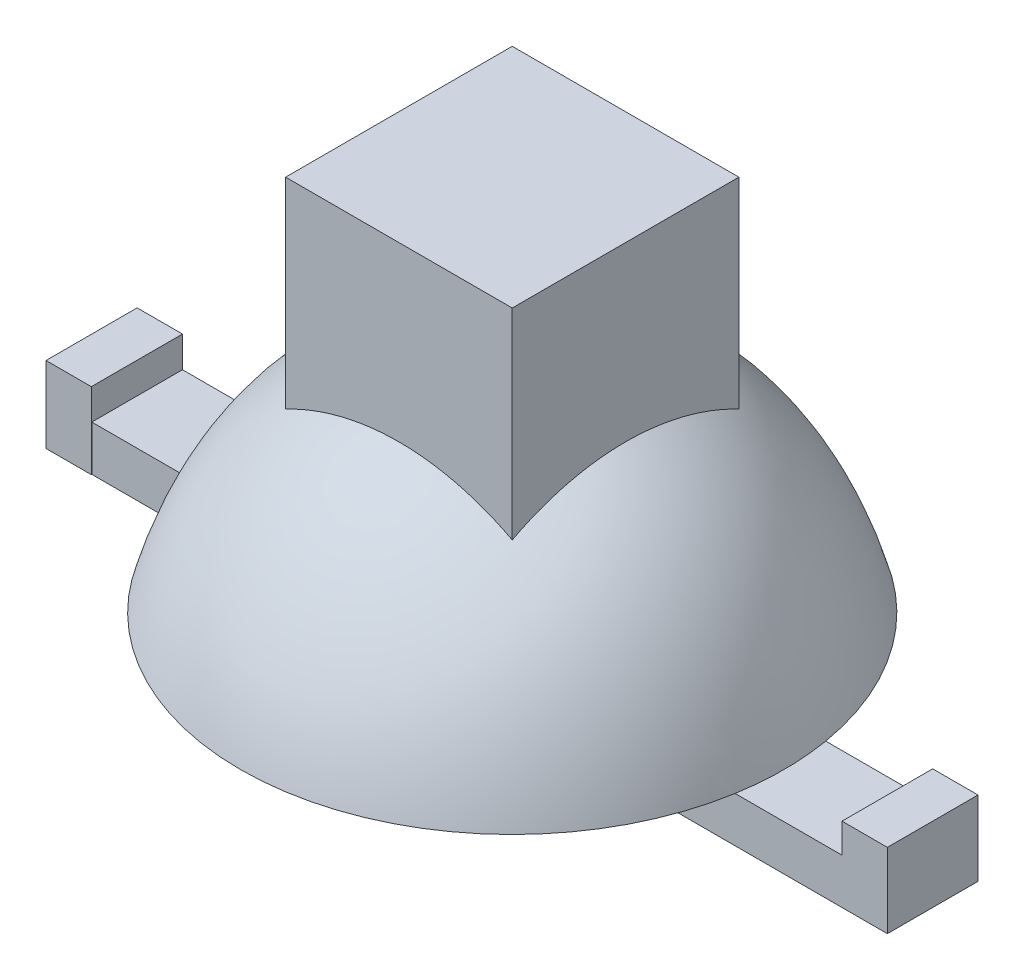
ISO-10303-21;
HEADER;
FILE_DESCRIPTION(('STEP AP214'),'2;1');
FILE_NAME('part.step','',(''),(''),'','','');
FILE_SCHEMA(('AUTOMOTIVE_DESIGN { 1 0 10303 214 1 1 1 1 }'));
ENDSEC;
DATA;
#1=APPLICATION_CONTEXT('core data for automotive mechanical design processes');
#2=APPLICATION_PROTOCOL_DEFINITION('international standard','automotive_design',2000,#1);
#3=PRODUCT_CONTEXT('',#1,'mechanical');
#4=PRODUCT('Part','Part','',(#3));
#5=PRODUCT_RELATED_PRODUCT_CATEGORY('part','',(#4));
#6=PRODUCT_DEFINITION_FORMATION('','',#4);
#7=PRODUCT_DEFINITION_CONTEXT('part definition',#1,'design');
#8=PRODUCT_DEFINITION('design','',#6,#7);
#9=PRODUCT_DEFINITION_SHAPE('','',#8);
#10=(LENGTH_UNIT() NAMED_UNIT(*) SI_UNIT(.MILLI.,.METRE.));
#11=(NAMED_UNIT(*) PLANE_ANGLE_UNIT() SI_UNIT($,.RADIAN.));
#12=(NAMED_UNIT(*) SI_UNIT($,.STERADIAN.) SOLID_ANGLE_UNIT());
#13=UNCERTAINTY_MEASURE_WITH_UNIT(LENGTH_MEASURE(1.E-05),#10,'distance_accuracy_value','');
#14=(GEOMETRIC_REPRESENTATION_CONTEXT(3) GLOBAL_UNCERTAINTY_ASSIGNED_CONTEXT((#13)) GLOBAL_UNIT_ASSIGNED_CONTEXT((#10,
#11,#12)) REPRESENTATION_CONTEXT('',''));
#15=CARTESIAN_POINT('',(0.,0.,0.));
#16=DIRECTION('',(0.,0.,1.));
#17=DIRECTION('',(1.,0.,0.));
#18=AXIS2_PLACEMENT_3D('',#15,#16,#17);
#19=CARTESIAN_POINT('',(-6.,-6.81709450569636,0.));
#20=DIRECTION('',(0.,1.,0.));
#21=DIRECTION('',(-1.,0.,0.));
#22=AXIS2_PLACEMENT_3D('',#19,#20,#21);
#23=PLANE('',#22);
#24=DIRECTION('',(1.,0.,0.));
#25=VECTOR('',#24,1.);
#26=CARTESIAN_POINT('',(-8.275,-6.81709450569636,-1.));
#27=LINE('',#26,#25);
#28=CARTESIAN_POINT('',(-5.91607978309962,-6.81709450569636,-1.));
#29=VERTEX_POINT('',#28);
#30=CARTESIAN_POINT('',(5.91607978309962,-6.81709450569636,-1.));
#31=VERTEX_POINT('',#30);
#32=EDGE_CURVE('E11',#29,#31,#27,.T.);
#33=ORIENTED_EDGE('',*,*,#32,.F.);
#34=CARTESIAN_POINT('',(0.,-6.81709450569636,0.));
#35=DIRECTION('',(0.,-1.,0.));
#36=DIRECTION('',(1.,0.,0.));
#37=AXIS2_PLACEMENT_3D('',#34,#35,#36);
#38=CIRCLE('',#37,6.);
#39=EDGE_CURVE('E346',#29,#31,#38,.T.);
#40=ORIENTED_EDGE('',*,*,#39,.T.);
#41=EDGE_LOOP('',(#33,#40));
#42=FACE_BOUND('',#41,.T.);
#43=ADVANCED_FACE('F39',(#42),#23,.F.);
#44=DIRECTION('',(-1.,0.,0.));
#45=VECTOR('',#44,1.);
#46=CARTESIAN_POINT('',(-8.275,-6.81709450569636,1.));
#47=LINE('',#46,#45);
#48=CARTESIAN_POINT('',(5.91607978309962,-6.81709450569636,1.));
#49=VERTEX_POINT('',#48);
#50=CARTESIAN_POINT('',(-5.91607978309962,-6.81709450569636,1.));
#51=VERTEX_POINT('',#50);
#52=EDGE_CURVE('E56',#49,#51,#47,.T.);
#53=ORIENTED_EDGE('',*,*,#52,.F.);
#54=EDGE_CURVE('E268',#49,#51,#38,.T.);
#55=ORIENTED_EDGE('',*,*,#54,.T.);
#56=EDGE_LOOP('',(#53,#55));
#57=FACE_BOUND('',#56,.T.);
#58=ADVANCED_FACE('F322',(#57),#23,.F.);
#59=CARTESIAN_POINT('',(2.5,1.5,2.5));
#60=DIRECTION('',(-1.,0.,0.));
#61=DIRECTION('',(0.,0.,1.));
#62=AXIS2_PLACEMENT_3D('',#59,#60,#61);
#63=PLANE('',#62);
#64=CARTESIAN_POINT('',(2.5,-2.93245789183974,-2.5));
#65=CARTESIAN_POINT('',(2.5,-2.83979215882481,-2.32491656996443));
#66=CARTESIAN_POINT('',(2.5,-2.75684454621896,-2.14466514826517));
#67=CARTESIAN_POINT('',(2.5,-2.61104994883105,-1.7758119828816));
#68=CARTESIAN_POINT('',(2.5,-2.54824124521255,-1.58719510296349));
#69=CARTESIAN_POINT('',(2.5,-2.45663979263033,-1.25152737468417));
#70=CARTESIAN_POINT('',(2.5,-2.42327761314768,-1.10570649185095));
#71=CARTESIAN_POINT('',(2.5,-2.36889057910474,-0.811790914458634));
#72=CARTESIAN_POINT('',(2.5,-2.34786357998313,-0.663696619745843));
#73=CARTESIAN_POINT('',(2.5,-2.31847551886501,-0.366163107254769));
#74=CARTESIAN_POINT('',(2.5,-2.31012215734251,-0.216723127260023));
#75=CARTESIAN_POINT('',(2.5,-2.30627513196048,0.0823076162683028));
#76=CARTESIAN_POINT('',(2.5,-2.31078033521077,0.231898365357743));
#77=CARTESIAN_POINT('',(2.5,-2.33249713029378,0.529320876107763));
#78=CARTESIAN_POINT('',(2.5,-2.34963749134787,0.677157796493806));
#79=CARTESIAN_POINT('',(2.5,-2.39623050455771,0.97089301723924));
#80=CARTESIAN_POINT('',(2.5,-2.42568871273047,1.11679041208858));
#81=CARTESIAN_POINT('',(2.49999999999999,-2.53192674359188,1.54960860647452));
#82=CARTESIAN_POINT('',(2.49999999999996,-2.62662699360426,1.83240276379467));
#83=CARTESIAN_POINT('',(2.49999999999997,-2.80128291598069,2.23942516580084));
#84=CARTESIAN_POINT('',(2.49999999999998,-2.86425604478754,2.37117204670822));
#85=CARTESIAN_POINT('',(2.5,-2.93245789183973,2.5));
#86=B_SPLINE_CURVE_WITH_KNOTS('',3,(#64,#65,#66,#67,#68,#69,#70,#71,#72,#73,#74,#75,#76,#77,#78,
#79,#80,#81,#82,#83,#84,#85),.UNSPECIFIED.,.F.,.F.,(4,2,2,2,2,2,2,2,2,2,4),(0.,0.59403521835317,
1.18919300845583,1.63746859656757,2.08566622557466,2.53413606955782,2.98256640280187,
3.42848785608875,3.87461066146684,4.76463420789656,5.20215384681799),.UNSPECIFIED.);
#87=CARTESIAN_POINT('',(2.5,-2.93245789183974,-2.5));
#88=VERTEX_POINT('',#87);
#89=CARTESIAN_POINT('',(2.5,-2.93245789183973,2.5));
#90=VERTEX_POINT('',#89);
#91=EDGE_CURVE('E299',#88,#90,#86,.T.);
#92=ORIENTED_EDGE('',*,*,#91,.F.);
#93=DIRECTION('',(0.,-1.,0.));
#94=VECTOR('',#93,1.);
#95=CARTESIAN_POINT('',(2.5,1.5,-2.5));
#96=LINE('',#95,#94);
#97=CARTESIAN_POINT('',(2.5,1.5,-2.5));
#98=VERTEX_POINT('',#97);
#99=EDGE_CURVE('E430',#98,#88,#96,.T.);
#100=ORIENTED_EDGE('',*,*,#99,.F.);
#101=DIRECTION('',(0.,0.,-1.));
#102=VECTOR('',#101,1.);
#103=CARTESIAN_POINT('',(2.5,1.5,2.5));
#104=LINE('',#103,#102);
#105=CARTESIAN_POINT('',(2.5,1.5,2.5));
#106=VERTEX_POINT('',#105);
#107=EDGE_CURVE('E408',#106,#98,#104,.T.);
#108=ORIENTED_EDGE('',*,*,#107,.F.);
#109=DIRECTION('',(0.,-1.,0.));
#110=VECTOR('',#109,1.);
#111=CARTESIAN_POINT('',(2.5,1.5,2.5));
#112=LINE('',#111,#110);
#113=EDGE_CURVE('E419',#106,#90,#112,.T.);
#114=ORIENTED_EDGE('',*,*,#113,.T.);
#115=EDGE_LOOP('',(#92,#100,#108,#114));
#116=FACE_BOUND('',#115,.T.);
#117=ADVANCED_FACE('F41',(#116),#63,.F.);
#118=CARTESIAN_POINT('',(-2.5,1.5,-2.5));
#119=DIRECTION('',(0.,0.,1.));
#120=DIRECTION('',(1.,0.,0.));
#121=AXIS2_PLACEMENT_3D('',#118,#119,#120);
#122=PLANE('',#121);
#123=CARTESIAN_POINT('',(-2.5,-2.93245789183974,-2.5));
#124=CARTESIAN_POINT('',(-2.32491656996443,-2.83979215882481,-2.5));
#125=CARTESIAN_POINT('',(-2.14466514826517,-2.75684454621896,-2.5));
#126=CARTESIAN_POINT('',(-1.7758119828816,-2.61104994883105,-2.5));
#127=CARTESIAN_POINT('',(-1.58719510296349,-2.54824124521255,-2.5));
#128=CARTESIAN_POINT('',(-1.25152737468417,-2.45663979263033,-2.5));
#129=CARTESIAN_POINT('',(-1.10570649185095,-2.42327761314768,-2.5));
#130=CARTESIAN_POINT('',(-0.811790914458635,-2.36889057910474,-2.5));
#131=CARTESIAN_POINT('',(-0.663696619745843,-2.34786357998313,-2.5));
#132=CARTESIAN_POINT('',(-0.36616310725477,-2.31847551886502,-2.5));
#133=CARTESIAN_POINT('',(-0.216723127260024,-2.31012215734251,-2.5));
#134=CARTESIAN_POINT('',(0.0823076162683029,-2.30627513196047,-2.5));
#135=CARTESIAN_POINT('',(0.231898365357743,-2.31078033521077,-2.5));
#136=CARTESIAN_POINT('',(0.529320876107764,-2.33249713029378,-2.5));
#137=CARTESIAN_POINT('',(0.677157796493806,-2.34963749134788,-2.5));
#138=CARTESIAN_POINT('',(0.970893017239241,-2.39623050455771,-2.5));
#139=CARTESIAN_POINT('',(1.11679041208858,-2.42568871273047,-2.5));
#140=CARTESIAN_POINT('',(1.54960860647452,-2.53192674359188,-2.49999999999999));
#141=CARTESIAN_POINT('',(1.83240276379467,-2.62662699360425,-2.49999999999996));
#142=CARTESIAN_POINT('',(2.23942516580084,-2.80128291598069,-2.49999999999997));
#143=CARTESIAN_POINT('',(2.37117204670822,-2.86425604478754,-2.49999999999998));
#144=CARTESIAN_POINT('',(2.5,-2.93245789183974,-2.5));
#145=B_SPLINE_CURVE_WITH_KNOTS('',3,(#123,#124,#125,#126,#127,#128,#129,#130,#131,#132,#133,
#134,#135,#136,#137,#138,#139,#140,#141,#142,#143,#144),.UNSPECIFIED.,.F.,.F.,(4,2,2,2,2,2,2,2,
2,2,4),(0.,0.59403521835317,1.18919300845583,1.63746859656757,2.08566622557466,2.53413606955781,
2.98256640280187,3.42848785608875,3.87461066146684,4.76463420789656,5.20215384681799),.UNSPECIFIED.);
#146=CARTESIAN_POINT('',(-2.5,-2.93245789183973,-2.5));
#147=VERTEX_POINT('',#146);
#148=EDGE_CURVE('E292',#147,#88,#145,.T.);
#149=ORIENTED_EDGE('',*,*,#148,.F.);
#150=DIRECTION('',(0.,-1.,0.));
#151=VECTOR('',#150,1.);
#152=CARTESIAN_POINT('',(-2.5,1.5,-2.5));
#153=LINE('',#152,#151);
#154=CARTESIAN_POINT('',(-2.5,1.5,-2.5));
#155=VERTEX_POINT('',#154);
#156=EDGE_CURVE('E426',#155,#147,#153,.T.);
#157=ORIENTED_EDGE('',*,*,#156,.F.);
#158=DIRECTION('',(-1.,0.,0.));
#159=VECTOR('',#158,1.);
#160=CARTESIAN_POINT('',(-2.5,1.5,-2.5));
#161=LINE('',#160,#159);
#162=EDGE_CURVE('E411',#98,#155,#161,.T.);
#163=ORIENTED_EDGE('',*,*,#162,.F.);
#164=ORIENTED_EDGE('',*,*,#99,.T.);
#165=EDGE_LOOP('',(#149,#157,#163,#164));
#166=FACE_BOUND('',#165,.T.);
#167=ADVANCED_FACE('F305',(#166),#122,.F.);
#168=CARTESIAN_POINT('',(-2.5,1.5,2.5));
#169=DIRECTION('',(1.,0.,0.));
#170=DIRECTION('',(0.,0.,-1.));
#171=AXIS2_PLACEMENT_3D('',#168,#169,#170);
#172=PLANE('',#171);
#173=CARTESIAN_POINT('',(-2.5,-2.93245789183974,2.5));
#174=CARTESIAN_POINT('',(-2.5,-2.83979215882481,2.32491656996443));
#175=CARTESIAN_POINT('',(-2.5,-2.75684454621896,2.14466514826517));
#176=CARTESIAN_POINT('',(-2.5,-2.61104994883105,1.7758119828816));
#177=CARTESIAN_POINT('',(-2.5,-2.54824124521255,1.58719510296349));
#178=CARTESIAN_POINT('',(-2.5,-2.45663979263033,1.25152737468417));
#179=CARTESIAN_POINT('',(-2.5,-2.42327761314768,1.10570649185095));
#180=CARTESIAN_POINT('',(-2.5,-2.36889057910474,0.811790914458634));
#181=CARTESIAN_POINT('',(-2.5,-2.34786357998313,0.663696619745843));
#182=CARTESIAN_POINT('',(-2.5,-2.31847551886502,0.366163107254769));
#183=CARTESIAN_POINT('',(-2.5,-2.31012215734251,0.216723127260023));
#184=CARTESIAN_POINT('',(-2.5,-2.30627513196047,-0.082307616268303));
#185=CARTESIAN_POINT('',(-2.5,-2.31078033521077,-0.231898365357743));
#186=CARTESIAN_POINT('',(-2.5,-2.33249713029378,-0.529320876107764));
#187=CARTESIAN_POINT('',(-2.5,-2.34963749134788,-0.677157796493807));
#188=CARTESIAN_POINT('',(-2.5,-2.39623050455771,-0.970893017239241));
#189=CARTESIAN_POINT('',(-2.5,-2.42568871273047,-1.11679041208858));
#190=CARTESIAN_POINT('',(-2.49999999999999,-2.53192674359188,-1.54960860647452));
#191=CARTESIAN_POINT('',(-2.49999999999996,-2.62662699360426,-1.83240276379467));
#192=CARTESIAN_POINT('',(-2.49999999999997,-2.80128291598069,-2.23942516580084));
#193=CARTESIAN_POINT('',(-2.49999999999997,-2.86425604478754,-2.37117204670822));
#194=CARTESIAN_POINT('',(-2.5,-2.93245789183974,-2.5));
#195=B_SPLINE_CURVE_WITH_KNOTS('',3,(#173,#174,#175,#176,#177,#178,#179,#180,#181,#182,#183,
#184,#185,#186,#187,#188,#189,#190,#191,#192,#193,#194),.UNSPECIFIED.,.F.,.F.,(4,2,2,2,2,2,2,2,
2,2,4),(0.,0.594035218353169,1.18919300845583,1.63746859656757,2.08566622557466,
2.53413606955782,2.98256640280187,3.42848785608875,3.87461066146684,4.76463420789656,
5.20215384681799),.UNSPECIFIED.);
#196=CARTESIAN_POINT('',(-2.5,-2.93245789183974,2.5));
#197=VERTEX_POINT('',#196);
#198=EDGE_CURVE('E285',#197,#147,#195,.T.);
#199=ORIENTED_EDGE('',*,*,#198,.F.);
#200=DIRECTION('',(0.,-1.,0.));
#201=VECTOR('',#200,1.);
#202=CARTESIAN_POINT('',(-2.5,1.5,2.5));
#203=LINE('',#202,#201);
#204=CARTESIAN_POINT('',(-2.5,1.5,2.5));
#205=VERTEX_POINT('',#204);
#206=EDGE_CURVE('E423',#205,#197,#203,.T.);
#207=ORIENTED_EDGE('',*,*,#206,.F.);
#208=DIRECTION('',(0.,0.,1.));
#209=VECTOR('',#208,1.);
#210=CARTESIAN_POINT('',(-2.5,1.5,2.5));
#211=LINE('',#210,#209);
#212=EDGE_CURVE('E413',#155,#205,#211,.T.);
#213=ORIENTED_EDGE('',*,*,#212,.F.);
#214=ORIENTED_EDGE('',*,*,#156,.T.);
#215=EDGE_LOOP('',(#199,#207,#213,#214));
#216=FACE_BOUND('',#215,.T.);
#217=ADVANCED_FACE('F308',(#216),#172,.F.);
#218=CARTESIAN_POINT('',(-2.5,1.5,2.5));
#219=DIRECTION('',(0.,0.,-1.));
#220=DIRECTION('',(-1.,0.,0.));
#221=AXIS2_PLACEMENT_3D('',#218,#219,#220);
#222=PLANE('',#221);
#223=CARTESIAN_POINT('',(2.5,-2.93245789183974,2.5));
#224=CARTESIAN_POINT('',(2.32491656996443,-2.83979215882481,2.5));
#225=CARTESIAN_POINT('',(2.14466514826517,-2.75684454621896,2.5));
#226=CARTESIAN_POINT('',(1.7758119828816,-2.61104994883105,2.5));
#227=CARTESIAN_POINT('',(1.58719510296349,-2.54824124521255,2.5));
#228=CARTESIAN_POINT('',(1.25152737468417,-2.45663979263033,2.5));
#229=CARTESIAN_POINT('',(1.10570649185095,-2.42327761314768,2.5));
#230=CARTESIAN_POINT('',(0.811790914458635,-2.36889057910474,2.5));
#231=CARTESIAN_POINT('',(0.663696619745843,-2.34786357998313,2.5));
#232=CARTESIAN_POINT('',(0.366163107254769,-2.31847551886502,2.5));
#233=CARTESIAN_POINT('',(0.216723127260023,-2.31012215734251,2.5));
#234=CARTESIAN_POINT('',(-0.0823076162683039,-2.30627513196047,2.5));
#235=CARTESIAN_POINT('',(-0.231898365357744,-2.31078033521077,2.5));
#236=CARTESIAN_POINT('',(-0.529320876107765,-2.33249713029378,2.5));
#237=CARTESIAN_POINT('',(-0.677157796493807,-2.34963749134788,2.5));
#238=CARTESIAN_POINT('',(-0.970893017239241,-2.39623050455771,2.5));
#239=CARTESIAN_POINT('',(-1.11679041208858,-2.42568871273047,2.5));
#240=CARTESIAN_POINT('',(-1.54960860647452,-2.53192674359188,2.49999999999999));
#241=CARTESIAN_POINT('',(-1.83240276379467,-2.62662699360426,2.49999999999996));
#242=CARTESIAN_POINT('',(-2.23942516580084,-2.80128291598069,2.49999999999997));
#243=CARTESIAN_POINT('',(-2.37117204670822,-2.86425604478754,2.49999999999998));
#244=CARTESIAN_POINT('',(-2.5,-2.93245789183974,2.5));
#245=B_SPLINE_CURVE_WITH_KNOTS('',3,(#223,#224,#225,#226,#227,#228,#229,#230,#231,#232,#233,
#234,#235,#236,#237,#238,#239,#240,#241,#242,#243,#244),.UNSPECIFIED.,.F.,.F.,(4,2,2,2,2,2,2,2,
2,2,4),(0.,0.59403521835317,1.18919300845583,1.63746859656757,2.08566622557466,2.53413606955782,
2.98256640280187,3.42848785608875,3.87461066146684,4.76463420789656,5.20215384681799),.UNSPECIFIED.);
#246=EDGE_CURVE('E44',#90,#197,#245,.T.);
#247=ORIENTED_EDGE('',*,*,#246,.F.);
#248=ORIENTED_EDGE('',*,*,#113,.F.);
#249=DIRECTION('',(1.,0.,0.));
#250=VECTOR('',#249,1.);
#251=CARTESIAN_POINT('',(-2.5,1.5,2.5));
#252=LINE('',#251,#250);
#253=EDGE_CURVE('E416',#205,#106,#252,.T.);
#254=ORIENTED_EDGE('',*,*,#253,.F.);
#255=ORIENTED_EDGE('',*,*,#206,.T.);
#256=EDGE_LOOP('',(#247,#248,#254,#255));
#257=FACE_BOUND('',#256,.T.);
#258=ADVANCED_FACE('F312',(#257),#222,.F.);
#259=CARTESIAN_POINT('',(0.,1.5,0.));
#260=DIRECTION('',(0.,-1.,0.));
#261=DIRECTION('',(0.,0.,-1.));
#262=AXIS2_PLACEMENT_3D('',#259,#260,#261);
#263=PLANE('',#262);
#264=ORIENTED_EDGE('',*,*,#107,.T.);
#265=ORIENTED_EDGE('',*,*,#162,.T.);
#266=ORIENTED_EDGE('',*,*,#212,.T.);
#267=ORIENTED_EDGE('',*,*,#253,.T.);
#268=EDGE_LOOP('',(#264,#265,#266,#267));
#269=FACE_BOUND('',#268,.T.);
#270=ADVANCED_FACE('F279',(#269),#263,.F.);
#271=CARTESIAN_POINT('',(0.,-1.61320223416099,0.));
#272=CARTESIAN_POINT('',(-4.73433884168897,-2.18439252783418,0.));
#273=CARTESIAN_POINT('',(-6.,-6.81709450569636,0.));
#274=B_SPLINE_CURVE_WITH_KNOTS('',2,(#271,#272,#273),.UNSPECIFIED.,.F.,.F.,(3,3),(0.,1.),.UNSPECIFIED.);
#275=CARTESIAN_POINT('',(0.,-6.81709450569636,0.));
#276=DIRECTION('',(0.,-1.,0.));
#277=AXIS1_PLACEMENT('',#275,#276);
#278=SURFACE_OF_REVOLUTION('',#274,#277);
#279=ORIENTED_EDGE('',*,*,#54,.F.);
#280=EDGE_CURVE('E66',#31,#49,#38,.T.);
#281=ORIENTED_EDGE('',*,*,#280,.F.);
#282=ORIENTED_EDGE('',*,*,#39,.F.);
#283=EDGE_CURVE('E338',#51,#29,#38,.T.);
#284=ORIENTED_EDGE('',*,*,#283,.F.);
#285=EDGE_LOOP('',(#279,#281,#282,#284));
#286=FACE_BOUND('',#285,.T.);
#287=ORIENTED_EDGE('',*,*,#148,.T.);
#288=ORIENTED_EDGE('',*,*,#91,.T.);
#289=ORIENTED_EDGE('',*,*,#246,.T.);
#290=ORIENTED_EDGE('',*,*,#198,.T.);
#291=EDGE_LOOP('',(#287,#288,#289,#290));
#292=FACE_BOUND('',#291,.T.);
#293=ADVANCED_FACE('F273',(#286,#292),#278,.T.);
#294=CARTESIAN_POINT('',(0.,-6.81709450569636,0.));
#295=DIRECTION('',(0.,1.,0.));
#296=DIRECTION('',(0.,0.,1.));
#297=AXIS2_PLACEMENT_3D('',#294,#295,#296);
#298=PLANE('',#297);
#299=CARTESIAN_POINT('',(-8.275,-6.81709450569636,1.));
#300=VERTEX_POINT('',#299);
#301=EDGE_CURVE('E251',#51,#300,#47,.T.);
#302=ORIENTED_EDGE('',*,*,#301,.F.);
#303=ORIENTED_EDGE('',*,*,#283,.T.);
#304=CARTESIAN_POINT('',(-8.275,-6.81709450569636,-1.));
#305=VERTEX_POINT('',#304);
#306=EDGE_CURVE('E58',#305,#29,#27,.T.);
#307=ORIENTED_EDGE('',*,*,#306,.F.);
#308=DIRECTION('',(0.,0.,-1.));
#309=VECTOR('',#308,1.);
#310=CARTESIAN_POINT('',(-8.275,-6.81709450569636,-1.));
#311=LINE('',#310,#309);
#312=EDGE_CURVE('E256',#300,#305,#311,.T.);
#313=ORIENTED_EDGE('',*,*,#312,.F.);
#314=EDGE_LOOP('',(#302,#303,#307,#313));
#315=FACE_BOUND('',#314,.T.);
#316=ADVANCED_FACE('F278',(#315),#298,.T.);
#317=CARTESIAN_POINT('',(-8.275,-7.81709450569636,1.));
#318=DIRECTION('',(0.,0.,-1.));
#319=DIRECTION('',(-1.,0.,0.));
#320=AXIS2_PLACEMENT_3D('',#317,#318,#319);
#321=PLANE('',#320);
#322=CARTESIAN_POINT('',(8.275,-6.81709450569636,1.));
#323=VERTEX_POINT('',#322);
#324=EDGE_CURVE('E252',#323,#49,#47,.T.);
#325=ORIENTED_EDGE('',*,*,#324,.T.);
#326=ORIENTED_EDGE('',*,*,#52,.T.);
#327=ORIENTED_EDGE('',*,*,#301,.T.);
#328=DIRECTION('',(0.,1.,0.));
#329=VECTOR('',#328,1.);
#330=CARTESIAN_POINT('',(-8.275,-7.81709450569636,1.));
#331=LINE('',#330,#329);
#332=CARTESIAN_POINT('',(-8.275,-7.81709450569636,1.));
#333=VERTEX_POINT('',#332);
#334=EDGE_CURVE('E168',#333,#300,#331,.T.);
#335=ORIENTED_EDGE('',*,*,#334,.F.);
#336=DIRECTION('',(-1.,0.,0.));
#337=VECTOR('',#336,1.);
#338=CARTESIAN_POINT('',(-8.275,-7.81709450569636,1.));
#339=LINE('',#338,#337);
#340=CARTESIAN_POINT('',(9.275,-7.81709450569636,1.));
#341=VERTEX_POINT('',#340);
#342=EDGE_CURVE('E169',#341,#333,#339,.T.);
#343=ORIENTED_EDGE('',*,*,#342,.F.);
#344=DIRECTION('',(0.,-1.,0.));
#345=VECTOR('',#344,1.);
#346=CARTESIAN_POINT('',(9.275,-7.81709450569636,1.));
#347=LINE('',#346,#345);
#348=CARTESIAN_POINT('',(9.275,-6.16655213963531,1.));
#349=VERTEX_POINT('',#348);
#350=EDGE_CURVE('E185',#349,#341,#347,.T.);
#351=ORIENTED_EDGE('',*,*,#350,.F.);
#352=DIRECTION('',(-1.,0.,0.));
#353=VECTOR('',#352,1.);
#354=CARTESIAN_POINT('',(9.275,-6.16655213963531,1.));
#355=LINE('',#354,#353);
#356=CARTESIAN_POINT('',(8.275,-6.16655213963531,1.));
#357=VERTEX_POINT('',#356);
#358=EDGE_CURVE('E198',#349,#357,#355,.T.);
#359=ORIENTED_EDGE('',*,*,#358,.T.);
#360=DIRECTION('',(0.,-1.,0.));
#361=VECTOR('',#360,1.);
#362=CARTESIAN_POINT('',(8.275,-7.81709450569636,1.));
#363=LINE('',#362,#361);
#364=EDGE_CURVE('E187',#357,#323,#363,.T.);
#365=ORIENTED_EDGE('',*,*,#364,.T.);
#366=EDGE_LOOP('',(#325,#326,#327,#335,#343,#351,#359,#365));
#367=FACE_BOUND('',#366,.T.);
#368=ADVANCED_FACE('F347',(#367),#321,.F.);
#369=CARTESIAN_POINT('',(-8.275,-7.81709450569636,-1.));
#370=DIRECTION('',(0.,0.,1.));
#371=DIRECTION('',(1.,0.,0.));
#372=AXIS2_PLACEMENT_3D('',#369,#370,#371);
#373=PLANE('',#372);
#374=ORIENTED_EDGE('',*,*,#306,.T.);
#375=ORIENTED_EDGE('',*,*,#32,.T.);
#376=CARTESIAN_POINT('',(8.275,-6.81709450569636,-1.));
#377=VERTEX_POINT('',#376);
#378=EDGE_CURVE('E59',#31,#377,#27,.T.);
#379=ORIENTED_EDGE('',*,*,#378,.T.);
#380=DIRECTION('',(0.,1.,0.));
#381=VECTOR('',#380,1.);
#382=CARTESIAN_POINT('',(8.275,-7.81709450569636,-1.));
#383=LINE('',#382,#381);
#384=CARTESIAN_POINT('',(8.275,-6.16655213963531,-1.));
#385=VERTEX_POINT('',#384);
#386=EDGE_CURVE('E199',#377,#385,#383,.T.);
#387=ORIENTED_EDGE('',*,*,#386,.T.);
#388=DIRECTION('',(-1.,0.,0.));
#389=VECTOR('',#388,1.);
#390=CARTESIAN_POINT('',(9.275,-6.16655213963531,-1.));
#391=LINE('',#390,#389);
#392=CARTESIAN_POINT('',(9.275,-6.16655213963531,-1.));
#393=VERTEX_POINT('',#392);
#394=EDGE_CURVE('E176',#393,#385,#391,.T.);
#395=ORIENTED_EDGE('',*,*,#394,.F.);
#396=DIRECTION('',(0.,1.,0.));
#397=VECTOR('',#396,1.);
#398=CARTESIAN_POINT('',(9.275,-7.81709450569636,-1.));
#399=LINE('',#398,#397);
#400=CARTESIAN_POINT('',(9.275,-7.81709450569636,-1.));
#401=VERTEX_POINT('',#400);
#402=EDGE_CURVE('E172',#401,#393,#399,.T.);
#403=ORIENTED_EDGE('',*,*,#402,.F.);
#404=DIRECTION('',(1.,0.,0.));
#405=VECTOR('',#404,1.);
#406=CARTESIAN_POINT('',(-8.275,-7.81709450569636,-1.));
#407=LINE('',#406,#405);
#408=CARTESIAN_POINT('',(-9.275,-7.81709450569636,-1.));
#409=VERTEX_POINT('',#408);
#410=EDGE_CURVE('E157',#409,#401,#407,.T.);
#411=ORIENTED_EDGE('',*,*,#410,.F.);
#412=DIRECTION('',(0.,-1.,0.));
#413=VECTOR('',#412,1.);
#414=CARTESIAN_POINT('',(-9.275,-6.13497165170822,-1.));
#415=LINE('',#414,#413);
#416=CARTESIAN_POINT('',(-9.275,-6.13497165170822,-1.));
#417=VERTEX_POINT('',#416);
#418=EDGE_CURVE('E210',#417,#409,#415,.T.);
#419=ORIENTED_EDGE('',*,*,#418,.F.);
#420=DIRECTION('',(1.,0.,0.));
#421=VECTOR('',#420,1.);
#422=CARTESIAN_POINT('',(-9.275,-6.13497165170822,-1.));
#423=LINE('',#422,#421);
#424=CARTESIAN_POINT('',(-8.275,-6.13497165170822,-1.));
#425=VERTEX_POINT('',#424);
#426=EDGE_CURVE('E222',#417,#425,#423,.T.);
#427=ORIENTED_EDGE('',*,*,#426,.T.);
#428=DIRECTION('',(0.,-1.,0.));
#429=VECTOR('',#428,1.);
#430=CARTESIAN_POINT('',(-8.275,-6.13497165170822,-1.));
#431=LINE('',#430,#429);
#432=EDGE_CURVE('E209',#425,#305,#431,.T.);
#433=ORIENTED_EDGE('',*,*,#432,.T.);
#434=EDGE_LOOP('',(#374,#375,#379,#387,#395,#403,#411,#419,#427,#433));
#435=FACE_BOUND('',#434,.T.);
#436=ADVANCED_FACE('F174',(#435),#373,.F.);
#437=CARTESIAN_POINT('',(0.,-7.81709450569636,0.));
#438=DIRECTION('',(0.,1.,0.));
#439=DIRECTION('',(0.,0.,1.));
#440=AXIS2_PLACEMENT_3D('',#437,#438,#439);
#441=PLANE('',#440);
#442=ORIENTED_EDGE('',*,*,#410,.T.);
#443=DIRECTION('',(0.,0.,-1.));
#444=VECTOR('',#443,1.);
#445=CARTESIAN_POINT('',(9.275,-7.81709450569636,1.));
#446=LINE('',#445,#444);
#447=EDGE_CURVE('E161',#341,#401,#446,.T.);
#448=ORIENTED_EDGE('',*,*,#447,.F.);
#449=ORIENTED_EDGE('',*,*,#342,.T.);
#450=DIRECTION('',(0.,0.,1.));
#451=VECTOR('',#450,1.);
#452=CARTESIAN_POINT('',(-8.275,-7.81709450569636,-1.));
#453=LINE('',#452,#451);
#454=CARTESIAN_POINT('',(-8.275,-7.81709450569636,1.010575613667));
#455=VERTEX_POINT('',#454);
#456=EDGE_CURVE('E226',#333,#455,#453,.T.);
#457=ORIENTED_EDGE('',*,*,#456,.T.);
#458=DIRECTION('',(1.,0.,0.));
#459=VECTOR('',#458,1.);
#460=CARTESIAN_POINT('',(-9.275,-7.81709450569636,1.010575613667));
#461=LINE('',#460,#459);
#462=CARTESIAN_POINT('',(-9.275,-7.81709450569636,1.010575613667));
#463=VERTEX_POINT('',#462);
#464=EDGE_CURVE('E241',#463,#455,#461,.T.);
#465=ORIENTED_EDGE('',*,*,#464,.F.);
#466=DIRECTION('',(0.,0.,1.));
#467=VECTOR('',#466,1.);
#468=CARTESIAN_POINT('',(-9.275,-7.81709450569636,-1.));
#469=LINE('',#468,#467);
#470=EDGE_CURVE('E163',#409,#463,#469,.T.);
#471=ORIENTED_EDGE('',*,*,#470,.F.);
#472=EDGE_LOOP('',(#442,#448,#449,#457,#465,#471));
#473=FACE_BOUND('',#472,.T.);
#474=ADVANCED_FACE('F159',(#473),#441,.F.);
#475=ORIENTED_EDGE('',*,*,#378,.F.);
#476=ORIENTED_EDGE('',*,*,#280,.T.);
#477=ORIENTED_EDGE('',*,*,#324,.F.);
#478=DIRECTION('',(0.,0.,1.));
#479=VECTOR('',#478,1.);
#480=CARTESIAN_POINT('',(8.275,-6.81709450569636,-1.));
#481=LINE('',#480,#479);
#482=EDGE_CURVE('E245',#377,#323,#481,.T.);
#483=ORIENTED_EDGE('',*,*,#482,.F.);
#484=EDGE_LOOP('',(#475,#476,#477,#483));
#485=FACE_BOUND('',#484,.T.);
#486=ADVANCED_FACE('F343',(#485),#298,.T.);
#487=CARTESIAN_POINT('',(-8.275,0.,0.));
#488=DIRECTION('',(-1.,0.,0.));
#489=DIRECTION('',(0.,0.,1.));
#490=AXIS2_PLACEMENT_3D('',#487,#488,#489);
#491=PLANE('',#490);
#492=ORIENTED_EDGE('',*,*,#334,.T.);
#493=ORIENTED_EDGE('',*,*,#312,.T.);
#494=ORIENTED_EDGE('',*,*,#432,.F.);
#495=DIRECTION('',(0.,0.,-1.));
#496=VECTOR('',#495,1.);
#497=CARTESIAN_POINT('',(-8.275,-6.13497165170822,1.010575613667));
#498=LINE('',#497,#496);
#499=CARTESIAN_POINT('',(-8.275,-6.13497165170822,1.010575613667));
#500=VERTEX_POINT('',#499);
#501=EDGE_CURVE('E213',#500,#425,#498,.T.);
#502=ORIENTED_EDGE('',*,*,#501,.F.);
#503=DIRECTION('',(0.,1.,0.));
#504=VECTOR('',#503,1.);
#505=CARTESIAN_POINT('',(-8.275,-7.81709450569636,1.010575613667));
#506=LINE('',#505,#504);
#507=EDGE_CURVE('E229',#455,#500,#506,.T.);
#508=ORIENTED_EDGE('',*,*,#507,.F.);
#509=ORIENTED_EDGE('',*,*,#456,.F.);
#510=EDGE_LOOP('',(#492,#493,#494,#502,#508,#509));
#511=FACE_BOUND('',#510,.T.);
#512=ADVANCED_FACE('F365',(#511),#491,.F.);
#513=CARTESIAN_POINT('',(-9.275,-7.81709450569636,1.010575613667));
#514=DIRECTION('',(0.,0.,-1.));
#515=DIRECTION('',(-1.,0.,0.));
#516=AXIS2_PLACEMENT_3D('',#513,#514,#515);
#517=PLANE('',#516);
#518=ORIENTED_EDGE('',*,*,#507,.T.);
#519=DIRECTION('',(1.,0.,0.));
#520=VECTOR('',#519,1.);
#521=CARTESIAN_POINT('',(-9.275,-6.13497165170822,1.010575613667));
#522=LINE('',#521,#520);
#523=CARTESIAN_POINT('',(-9.275,-6.13497165170822,1.010575613667));
#524=VERTEX_POINT('',#523);
#525=EDGE_CURVE('E237',#524,#500,#522,.T.);
#526=ORIENTED_EDGE('',*,*,#525,.F.);
#527=DIRECTION('',(0.,1.,0.));
#528=VECTOR('',#527,1.);
#529=CARTESIAN_POINT('',(-9.275,-7.81709450569636,1.010575613667));
#530=LINE('',#529,#528);
#531=EDGE_CURVE('E216',#463,#524,#530,.T.);
#532=ORIENTED_EDGE('',*,*,#531,.F.);
#533=ORIENTED_EDGE('',*,*,#464,.T.);
#534=EDGE_LOOP('',(#518,#526,#532,#533));
#535=FACE_BOUND('',#534,.T.);
#536=ADVANCED_FACE('F362',(#535),#517,.F.);
#537=CARTESIAN_POINT('',(-9.275,-6.13497165170822,1.010575613667));
#538=DIRECTION('',(0.,-1.,0.));
#539=DIRECTION('',(1.,0.,0.));
#540=AXIS2_PLACEMENT_3D('',#537,#538,#539);
#541=PLANE('',#540);
#542=ORIENTED_EDGE('',*,*,#501,.T.);
#543=ORIENTED_EDGE('',*,*,#426,.F.);
#544=DIRECTION('',(0.,0.,-1.));
#545=VECTOR('',#544,1.);
#546=CARTESIAN_POINT('',(-9.275,-6.13497165170822,1.010575613667));
#547=LINE('',#546,#545);
#548=EDGE_CURVE('E219',#524,#417,#547,.T.);
#549=ORIENTED_EDGE('',*,*,#548,.F.);
#550=ORIENTED_EDGE('',*,*,#525,.T.);
#551=EDGE_LOOP('',(#542,#543,#549,#550));
#552=FACE_BOUND('',#551,.T.);
#553=ADVANCED_FACE('F369',(#552),#541,.F.);
#554=CARTESIAN_POINT('',(-9.275,0.,0.));
#555=DIRECTION('',(-1.,0.,0.));
#556=DIRECTION('',(0.,0.,1.));
#557=AXIS2_PLACEMENT_3D('',#554,#555,#556);
#558=PLANE('',#557);
#559=ORIENTED_EDGE('',*,*,#418,.T.);
#560=ORIENTED_EDGE('',*,*,#470,.T.);
#561=ORIENTED_EDGE('',*,*,#531,.T.);
#562=ORIENTED_EDGE('',*,*,#548,.T.);
#563=EDGE_LOOP('',(#559,#560,#561,#562));
#564=FACE_BOUND('',#563,.T.);
#565=ADVANCED_FACE('F372',(#564),#558,.T.);
#566=CARTESIAN_POINT('',(8.275,0.,0.));
#567=DIRECTION('',(1.,0.,0.));
#568=DIRECTION('',(0.,0.,-1.));
#569=AXIS2_PLACEMENT_3D('',#566,#567,#568);
#570=PLANE('',#569);
#571=ORIENTED_EDGE('',*,*,#386,.F.);
#572=ORIENTED_EDGE('',*,*,#482,.T.);
#573=ORIENTED_EDGE('',*,*,#364,.F.);
#574=DIRECTION('',(0.,0.,1.));
#575=VECTOR('',#574,1.);
#576=CARTESIAN_POINT('',(8.275,-6.16655213963531,-1.));
#577=LINE('',#576,#575);
#578=EDGE_CURVE('E191',#385,#357,#577,.T.);
#579=ORIENTED_EDGE('',*,*,#578,.F.);
#580=EDGE_LOOP('',(#571,#572,#573,#579));
#581=FACE_BOUND('',#580,.T.);
#582=ADVANCED_FACE('F353',(#581),#570,.F.);
#583=CARTESIAN_POINT('',(9.275,-6.16655213963531,-1.));
#584=DIRECTION('',(0.,-1.,0.));
#585=DIRECTION('',(1.,0.,0.));
#586=AXIS2_PLACEMENT_3D('',#583,#584,#585);
#587=PLANE('',#586);
#588=ORIENTED_EDGE('',*,*,#578,.T.);
#589=ORIENTED_EDGE('',*,*,#358,.F.);
#590=DIRECTION('',(0.,0.,1.));
#591=VECTOR('',#590,1.);
#592=CARTESIAN_POINT('',(9.275,-6.16655213963531,-1.));
#593=LINE('',#592,#591);
#594=EDGE_CURVE('E180',#393,#349,#593,.T.);
#595=ORIENTED_EDGE('',*,*,#594,.F.);
#596=ORIENTED_EDGE('',*,*,#394,.T.);
#597=EDGE_LOOP('',(#588,#589,#595,#596));
#598=FACE_BOUND('',#597,.T.);
#599=ADVANCED_FACE('F355',(#598),#587,.F.);
#600=CARTESIAN_POINT('',(9.275,0.,0.));
#601=DIRECTION('',(1.,0.,0.));
#602=DIRECTION('',(0.,0.,-1.));
#603=AXIS2_PLACEMENT_3D('',#600,#601,#602);
#604=PLANE('',#603);
#605=ORIENTED_EDGE('',*,*,#447,.T.);
#606=ORIENTED_EDGE('',*,*,#402,.T.);
#607=ORIENTED_EDGE('',*,*,#594,.T.);
#608=ORIENTED_EDGE('',*,*,#350,.T.);
#609=EDGE_LOOP('',(#605,#606,#607,#608));
#610=FACE_BOUND('',#609,.T.);
#611=ADVANCED_FACE('F183',(#610),#604,.T.);
#612=CLOSED_SHELL('',(#43,#58,#117,#167,#217,#258,#270,#293,#316,#368,#436,#474,#486,#512,#536,
#553,#565,#582,#599,#611));
#613=MANIFOLD_SOLID_BREP('B2',#612);
#614=ADVANCED_BREP_SHAPE_REPRESENTATION('',(#18,#613),#14);
#615=SHAPE_DEFINITION_REPRESENTATION(#9,#614);
ENDSEC;
END-ISO-10303-21;
